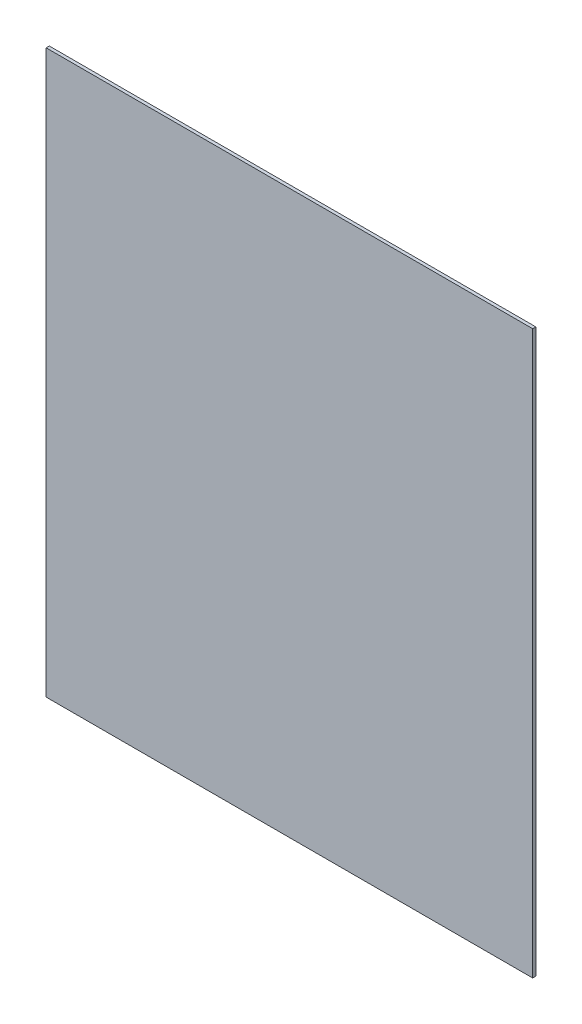
ISO-10303-21;
HEADER;
FILE_DESCRIPTION(('STEP AP214'),'2;1');
FILE_NAME('part.step','',(''),(''),'','','');
FILE_SCHEMA(('AUTOMOTIVE_DESIGN { 1 0 10303 214 1 1 1 1 }'));
ENDSEC;
DATA;
#1=APPLICATION_CONTEXT('core data for automotive mechanical design processes');
#2=APPLICATION_PROTOCOL_DEFINITION('international standard','automotive_design',2000,#1);
#3=PRODUCT_CONTEXT('',#1,'mechanical');
#4=PRODUCT('Part','Part','',(#3));
#5=PRODUCT_RELATED_PRODUCT_CATEGORY('part','',(#4));
#6=PRODUCT_DEFINITION_FORMATION('','',#4);
#7=PRODUCT_DEFINITION_CONTEXT('part definition',#1,'design');
#8=PRODUCT_DEFINITION('design','',#6,#7);
#9=PRODUCT_DEFINITION_SHAPE('','',#8);
#10=(LENGTH_UNIT() NAMED_UNIT(*) SI_UNIT(.MILLI.,.METRE.));
#11=(NAMED_UNIT(*) PLANE_ANGLE_UNIT() SI_UNIT($,.RADIAN.));
#12=(NAMED_UNIT(*) SI_UNIT($,.STERADIAN.) SOLID_ANGLE_UNIT());
#13=UNCERTAINTY_MEASURE_WITH_UNIT(LENGTH_MEASURE(1.E-05),#10,'distance_accuracy_value','');
#14=(GEOMETRIC_REPRESENTATION_CONTEXT(3) GLOBAL_UNCERTAINTY_ASSIGNED_CONTEXT((#13)) GLOBAL_UNIT_ASSIGNED_CONTEXT((#10,
#11,#12)) REPRESENTATION_CONTEXT('',''));
#15=CARTESIAN_POINT('',(0.,0.,0.));
#16=DIRECTION('',(0.,0.,1.));
#17=DIRECTION('',(1.,0.,0.));
#18=AXIS2_PLACEMENT_3D('',#15,#16,#17);
#19=CARTESIAN_POINT('',(385.,-445.,5.));
#20=DIRECTION('',(-1.,0.,0.));
#21=DIRECTION('',(0.,0.,1.));
#22=AXIS2_PLACEMENT_3D('',#19,#20,#21);
#23=PLANE('',#22);
#24=DIRECTION('',(0.,1.,0.));
#25=VECTOR('',#24,1.);
#26=CARTESIAN_POINT('',(385.,-445.,0.));
#27=LINE('',#26,#25);
#28=CARTESIAN_POINT('',(385.,-445.,0.));
#29=VERTEX_POINT('',#28);
#30=CARTESIAN_POINT('',(385.,445.,0.));
#31=VERTEX_POINT('',#30);
#32=EDGE_CURVE('E96',#29,#31,#27,.T.);
#33=ORIENTED_EDGE('',*,*,#32,.T.);
#34=DIRECTION('',(0.,0.,-1.));
#35=VECTOR('',#34,1.);
#36=CARTESIAN_POINT('',(385.,445.,5.));
#37=LINE('',#36,#35);
#38=CARTESIAN_POINT('',(385.,445.,5.));
#39=VERTEX_POINT('',#38);
#40=EDGE_CURVE('E11',#39,#31,#37,.T.);
#41=ORIENTED_EDGE('',*,*,#40,.F.);
#42=DIRECTION('',(0.,1.,0.));
#43=VECTOR('',#42,1.);
#44=CARTESIAN_POINT('',(385.,-445.,5.));
#45=LINE('',#44,#43);
#46=CARTESIAN_POINT('',(385.,-445.,5.));
#47=VERTEX_POINT('',#46);
#48=EDGE_CURVE('E84',#47,#39,#45,.T.);
#49=ORIENTED_EDGE('',*,*,#48,.F.);
#50=DIRECTION('',(0.,0.,-1.));
#51=VECTOR('',#50,1.);
#52=CARTESIAN_POINT('',(385.,-445.,5.));
#53=LINE('',#52,#51);
#54=EDGE_CURVE('E92',#47,#29,#53,.T.);
#55=ORIENTED_EDGE('',*,*,#54,.T.);
#56=EDGE_LOOP('',(#33,#41,#49,#55));
#57=FACE_BOUND('',#56,.T.);
#58=ADVANCED_FACE('F33',(#57),#23,.F.);
#59=CARTESIAN_POINT('',(-385.,445.,5.));
#60=DIRECTION('',(0.,-1.,0.));
#61=DIRECTION('',(0.,0.,-1.));
#62=AXIS2_PLACEMENT_3D('',#59,#60,#61);
#63=PLANE('',#62);
#64=DIRECTION('',(-1.,0.,0.));
#65=VECTOR('',#64,1.);
#66=CARTESIAN_POINT('',(-385.,445.,0.));
#67=LINE('',#66,#65);
#68=CARTESIAN_POINT('',(-385.,445.,0.));
#69=VERTEX_POINT('',#68);
#70=EDGE_CURVE('E88',#31,#69,#67,.T.);
#71=ORIENTED_EDGE('',*,*,#70,.T.);
#72=DIRECTION('',(0.,0.,-1.));
#73=VECTOR('',#72,1.);
#74=CARTESIAN_POINT('',(-385.,445.,5.));
#75=LINE('',#74,#73);
#76=CARTESIAN_POINT('',(-385.,445.,5.));
#77=VERTEX_POINT('',#76);
#78=EDGE_CURVE('E41',#77,#69,#75,.T.);
#79=ORIENTED_EDGE('',*,*,#78,.F.);
#80=DIRECTION('',(-1.,0.,0.));
#81=VECTOR('',#80,1.);
#82=CARTESIAN_POINT('',(-385.,445.,5.));
#83=LINE('',#82,#81);
#84=EDGE_CURVE('E79',#39,#77,#83,.T.);
#85=ORIENTED_EDGE('',*,*,#84,.F.);
#86=ORIENTED_EDGE('',*,*,#40,.T.);
#87=EDGE_LOOP('',(#71,#79,#85,#86));
#88=FACE_BOUND('',#87,.T.);
#89=ADVANCED_FACE('F87',(#88),#63,.F.);
#90=CARTESIAN_POINT('',(-385.,-445.,5.));
#91=DIRECTION('',(1.,0.,0.));
#92=DIRECTION('',(0.,0.,-1.));
#93=AXIS2_PLACEMENT_3D('',#90,#91,#92);
#94=PLANE('',#93);
#95=DIRECTION('',(0.,-1.,0.));
#96=VECTOR('',#95,1.);
#97=CARTESIAN_POINT('',(-385.,-445.,0.));
#98=LINE('',#97,#96);
#99=CARTESIAN_POINT('',(-385.,-445.,0.));
#100=VERTEX_POINT('',#99);
#101=EDGE_CURVE('E66',#69,#100,#98,.T.);
#102=ORIENTED_EDGE('',*,*,#101,.T.);
#103=DIRECTION('',(0.,0.,-1.));
#104=VECTOR('',#103,1.);
#105=CARTESIAN_POINT('',(-385.,-445.,5.));
#106=LINE('',#105,#104);
#107=CARTESIAN_POINT('',(-385.,-445.,5.));
#108=VERTEX_POINT('',#107);
#109=EDGE_CURVE('E89',#108,#100,#106,.T.);
#110=ORIENTED_EDGE('',*,*,#109,.F.);
#111=DIRECTION('',(0.,-1.,0.));
#112=VECTOR('',#111,1.);
#113=CARTESIAN_POINT('',(-385.,-445.,5.));
#114=LINE('',#113,#112);
#115=EDGE_CURVE('E82',#77,#108,#114,.T.);
#116=ORIENTED_EDGE('',*,*,#115,.F.);
#117=ORIENTED_EDGE('',*,*,#78,.T.);
#118=EDGE_LOOP('',(#102,#110,#116,#117));
#119=FACE_BOUND('',#118,.T.);
#120=ADVANCED_FACE('F90',(#119),#94,.F.);
#121=CARTESIAN_POINT('',(-385.,-445.,5.));
#122=DIRECTION('',(0.,1.,0.));
#123=DIRECTION('',(0.,0.,1.));
#124=AXIS2_PLACEMENT_3D('',#121,#122,#123);
#125=PLANE('',#124);
#126=DIRECTION('',(1.,0.,0.));
#127=VECTOR('',#126,1.);
#128=CARTESIAN_POINT('',(-385.,-445.,0.));
#129=LINE('',#128,#127);
#130=EDGE_CURVE('E72',#100,#29,#129,.T.);
#131=ORIENTED_EDGE('',*,*,#130,.T.);
#132=ORIENTED_EDGE('',*,*,#54,.F.);
#133=DIRECTION('',(1.,0.,0.));
#134=VECTOR('',#133,1.);
#135=CARTESIAN_POINT('',(-385.,-445.,5.));
#136=LINE('',#135,#134);
#137=EDGE_CURVE('E49',#108,#47,#136,.T.);
#138=ORIENTED_EDGE('',*,*,#137,.F.);
#139=ORIENTED_EDGE('',*,*,#109,.T.);
#140=EDGE_LOOP('',(#131,#132,#138,#139));
#141=FACE_BOUND('',#140,.T.);
#142=ADVANCED_FACE('F103',(#141),#125,.F.);
#143=CARTESIAN_POINT('',(0.,0.,5.));
#144=DIRECTION('',(0.,0.,-1.));
#145=DIRECTION('',(-1.,0.,0.));
#146=AXIS2_PLACEMENT_3D('',#143,#144,#145);
#147=PLANE('',#146);
#148=ORIENTED_EDGE('',*,*,#48,.T.);
#149=ORIENTED_EDGE('',*,*,#84,.T.);
#150=ORIENTED_EDGE('',*,*,#115,.T.);
#151=ORIENTED_EDGE('',*,*,#137,.T.);
#152=EDGE_LOOP('',(#148,#149,#150,#151));
#153=FACE_BOUND('',#152,.T.);
#154=ADVANCED_FACE('F80',(#153),#147,.F.);
#155=CARTESIAN_POINT('',(0.,0.,0.));
#156=DIRECTION('',(0.,0.,-1.));
#157=DIRECTION('',(-1.,0.,0.));
#158=AXIS2_PLACEMENT_3D('',#155,#156,#157);
#159=PLANE('',#158);
#160=ORIENTED_EDGE('',*,*,#32,.F.);
#161=ORIENTED_EDGE('',*,*,#130,.F.);
#162=ORIENTED_EDGE('',*,*,#101,.F.);
#163=ORIENTED_EDGE('',*,*,#70,.F.);
#164=EDGE_LOOP('',(#160,#161,#162,#163));
#165=FACE_BOUND('',#164,.T.);
#166=ADVANCED_FACE('F106',(#165),#159,.T.);
#167=CLOSED_SHELL('',(#58,#89,#120,#142,#154,#166));
#168=MANIFOLD_SOLID_BREP('B2',#167);
#169=ADVANCED_BREP_SHAPE_REPRESENTATION('',(#18,#168),#14);
#170=SHAPE_DEFINITION_REPRESENTATION(#9,#169);
ENDSEC;
END-ISO-10303-21;
